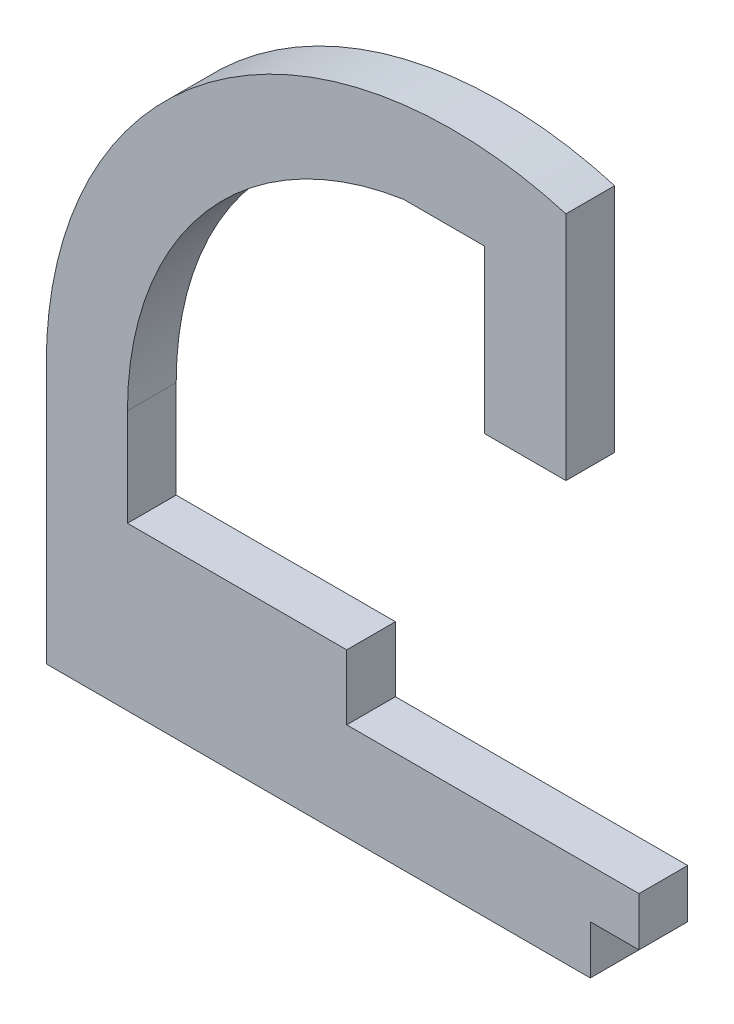
ISO-10303-21;
HEADER;
FILE_DESCRIPTION(('STEP AP214'),'2;1');
FILE_NAME('part.step','',(''),(''),'','','');
FILE_SCHEMA(('AUTOMOTIVE_DESIGN { 1 0 10303 214 1 1 1 1 }'));
ENDSEC;
DATA;
#1=APPLICATION_CONTEXT('core data for automotive mechanical design processes');
#2=APPLICATION_PROTOCOL_DEFINITION('international standard','automotive_design',2000,#1);
#3=PRODUCT_CONTEXT('',#1,'mechanical');
#4=PRODUCT('Part','Part','',(#3));
#5=PRODUCT_RELATED_PRODUCT_CATEGORY('part','',(#4));
#6=PRODUCT_DEFINITION_FORMATION('','',#4);
#7=PRODUCT_DEFINITION_CONTEXT('part definition',#1,'design');
#8=PRODUCT_DEFINITION('design','',#6,#7);
#9=PRODUCT_DEFINITION_SHAPE('','',#8);
#10=(LENGTH_UNIT() NAMED_UNIT(*) SI_UNIT(.MILLI.,.METRE.));
#11=(NAMED_UNIT(*) PLANE_ANGLE_UNIT() SI_UNIT($,.RADIAN.));
#12=(NAMED_UNIT(*) SI_UNIT($,.STERADIAN.) SOLID_ANGLE_UNIT());
#13=UNCERTAINTY_MEASURE_WITH_UNIT(LENGTH_MEASURE(1.E-05),#10,'distance_accuracy_value','');
#14=(GEOMETRIC_REPRESENTATION_CONTEXT(3) GLOBAL_UNCERTAINTY_ASSIGNED_CONTEXT((#13)) GLOBAL_UNIT_ASSIGNED_CONTEXT((#10,
#11,#12)) REPRESENTATION_CONTEXT('',''));
#15=CARTESIAN_POINT('',(0.,0.,0.));
#16=DIRECTION('',(0.,0.,1.));
#17=DIRECTION('',(1.,0.,0.));
#18=AXIS2_PLACEMENT_3D('',#15,#16,#17);
#19=CARTESIAN_POINT('',(0.,0.,6.));
#20=DIRECTION('',(0.,1.,0.));
#21=DIRECTION('',(0.,0.,1.));
#22=AXIS2_PLACEMENT_3D('',#19,#20,#21);
#23=PLANE('',#22);
#24=DIRECTION('',(1.,0.,0.));
#25=VECTOR('',#24,1.);
#26=CARTESIAN_POINT('',(0.,0.,0.));
#27=LINE('',#26,#25);
#28=CARTESIAN_POINT('',(0.,0.,0.));
#29=VERTEX_POINT('',#28);
#30=CARTESIAN_POINT('',(67.,0.,0.));
#31=VERTEX_POINT('',#30);
#32=EDGE_CURVE('E171',#29,#31,#27,.T.);
#33=ORIENTED_EDGE('',*,*,#32,.T.);
#34=DIRECTION('',(0.,0.,-1.));
#35=VECTOR('',#34,1.);
#36=CARTESIAN_POINT('',(67.,0.,6.));
#37=LINE('',#36,#35);
#38=CARTESIAN_POINT('',(67.,0.,6.));
#39=VERTEX_POINT('',#38);
#40=EDGE_CURVE('E11',#39,#31,#37,.T.);
#41=ORIENTED_EDGE('',*,*,#40,.F.);
#42=DIRECTION('',(1.,0.,0.));
#43=VECTOR('',#42,1.);
#44=CARTESIAN_POINT('',(0.,0.,6.));
#45=LINE('',#44,#43);
#46=CARTESIAN_POINT('',(0.,0.,6.));
#47=VERTEX_POINT('',#46);
#48=EDGE_CURVE('E200',#47,#39,#45,.T.);
#49=ORIENTED_EDGE('',*,*,#48,.F.);
#50=DIRECTION('',(0.,0.,-1.));
#51=VECTOR('',#50,1.);
#52=CARTESIAN_POINT('',(0.,0.,6.));
#53=LINE('',#52,#51);
#54=EDGE_CURVE('E167',#47,#29,#53,.T.);
#55=ORIENTED_EDGE('',*,*,#54,.T.);
#56=EDGE_LOOP('',(#33,#41,#49,#55));
#57=FACE_BOUND('',#56,.T.);
#58=ADVANCED_FACE('F33',(#57),#23,.F.);
#59=CARTESIAN_POINT('',(67.,6.,6.));
#60=DIRECTION('',(-1.,0.,0.));
#61=DIRECTION('',(0.,0.,1.));
#62=AXIS2_PLACEMENT_3D('',#59,#60,#61);
#63=PLANE('',#62);
#64=DIRECTION('',(0.,1.,0.));
#65=VECTOR('',#64,1.);
#66=CARTESIAN_POINT('',(67.,6.,0.));
#67=LINE('',#66,#65);
#68=CARTESIAN_POINT('',(67.,6.,0.));
#69=VERTEX_POINT('',#68);
#70=EDGE_CURVE('E174',#31,#69,#67,.T.);
#71=ORIENTED_EDGE('',*,*,#70,.T.);
#72=DIRECTION('',(0.,0.,-1.));
#73=VECTOR('',#72,1.);
#74=CARTESIAN_POINT('',(67.,6.,6.));
#75=LINE('',#74,#73);
#76=CARTESIAN_POINT('',(67.,6.,6.));
#77=VERTEX_POINT('',#76);
#78=EDGE_CURVE('E41',#77,#69,#75,.T.);
#79=ORIENTED_EDGE('',*,*,#78,.F.);
#80=DIRECTION('',(0.,1.,0.));
#81=VECTOR('',#80,1.);
#82=CARTESIAN_POINT('',(67.,6.,6.));
#83=LINE('',#82,#81);
#84=EDGE_CURVE('E113',#39,#77,#83,.T.);
#85=ORIENTED_EDGE('',*,*,#84,.F.);
#86=ORIENTED_EDGE('',*,*,#40,.T.);
#87=EDGE_LOOP('',(#71,#79,#85,#86));
#88=FACE_BOUND('',#87,.T.);
#89=ADVANCED_FACE('F292',(#88),#63,.F.);
#90=CARTESIAN_POINT('',(73.,6.,6.));
#91=DIRECTION('',(0.,1.,0.));
#92=DIRECTION('',(-1.,0.,0.));
#93=AXIS2_PLACEMENT_3D('',#90,#91,#92);
#94=PLANE('',#93);
#95=DIRECTION('',(1.,0.,0.));
#96=VECTOR('',#95,1.);
#97=CARTESIAN_POINT('',(73.,6.,0.));
#98=LINE('',#97,#96);
#99=CARTESIAN_POINT('',(73.,6.,0.));
#100=VERTEX_POINT('',#99);
#101=EDGE_CURVE('E176',#69,#100,#98,.T.);
#102=ORIENTED_EDGE('',*,*,#101,.T.);
#103=DIRECTION('',(0.,0.,-1.));
#104=VECTOR('',#103,1.);
#105=CARTESIAN_POINT('',(73.,6.,6.));
#106=LINE('',#105,#104);
#107=CARTESIAN_POINT('',(73.,6.,6.));
#108=VERTEX_POINT('',#107);
#109=EDGE_CURVE('E228',#108,#100,#106,.T.);
#110=ORIENTED_EDGE('',*,*,#109,.F.);
#111=DIRECTION('',(1.,0.,0.));
#112=VECTOR('',#111,1.);
#113=CARTESIAN_POINT('',(73.,6.,6.));
#114=LINE('',#113,#112);
#115=EDGE_CURVE('E236',#77,#108,#114,.T.);
#116=ORIENTED_EDGE('',*,*,#115,.F.);
#117=ORIENTED_EDGE('',*,*,#78,.T.);
#118=EDGE_LOOP('',(#102,#110,#116,#117));
#119=FACE_BOUND('',#118,.T.);
#120=ADVANCED_FACE('F234',(#119),#94,.F.);
#121=CARTESIAN_POINT('',(73.,12.,6.));
#122=DIRECTION('',(-1.,0.,0.));
#123=DIRECTION('',(0.,0.,1.));
#124=AXIS2_PLACEMENT_3D('',#121,#122,#123);
#125=PLANE('',#124);
#126=DIRECTION('',(0.,1.,0.));
#127=VECTOR('',#126,1.);
#128=CARTESIAN_POINT('',(73.,12.,0.));
#129=LINE('',#128,#127);
#130=CARTESIAN_POINT('',(73.,12.,0.));
#131=VERTEX_POINT('',#130);
#132=EDGE_CURVE('E178',#100,#131,#129,.T.);
#133=ORIENTED_EDGE('',*,*,#132,.T.);
#134=DIRECTION('',(0.,0.,-1.));
#135=VECTOR('',#134,1.);
#136=CARTESIAN_POINT('',(73.,12.,6.));
#137=LINE('',#136,#135);
#138=CARTESIAN_POINT('',(73.,12.,6.));
#139=VERTEX_POINT('',#138);
#140=EDGE_CURVE('E225',#139,#131,#137,.T.);
#141=ORIENTED_EDGE('',*,*,#140,.F.);
#142=DIRECTION('',(0.,1.,0.));
#143=VECTOR('',#142,1.);
#144=CARTESIAN_POINT('',(73.,12.,6.));
#145=LINE('',#144,#143);
#146=EDGE_CURVE('E253',#108,#139,#145,.T.);
#147=ORIENTED_EDGE('',*,*,#146,.F.);
#148=ORIENTED_EDGE('',*,*,#109,.T.);
#149=EDGE_LOOP('',(#133,#141,#147,#148));
#150=FACE_BOUND('',#149,.T.);
#151=ADVANCED_FACE('F244',(#150),#125,.F.);
#152=CARTESIAN_POINT('',(37.,12.,6.));
#153=DIRECTION('',(0.,-1.,0.));
#154=DIRECTION('',(0.,0.,-1.));
#155=AXIS2_PLACEMENT_3D('',#152,#153,#154);
#156=PLANE('',#155);
#157=DIRECTION('',(-1.,0.,0.));
#158=VECTOR('',#157,1.);
#159=CARTESIAN_POINT('',(37.,12.,0.));
#160=LINE('',#159,#158);
#161=CARTESIAN_POINT('',(37.,12.,0.));
#162=VERTEX_POINT('',#161);
#163=EDGE_CURVE('E181',#131,#162,#160,.T.);
#164=ORIENTED_EDGE('',*,*,#163,.T.);
#165=DIRECTION('',(0.,0.,-1.));
#166=VECTOR('',#165,1.);
#167=CARTESIAN_POINT('',(37.,12.,6.));
#168=LINE('',#167,#166);
#169=CARTESIAN_POINT('',(37.,12.,6.));
#170=VERTEX_POINT('',#169);
#171=EDGE_CURVE('E222',#170,#162,#168,.T.);
#172=ORIENTED_EDGE('',*,*,#171,.F.);
#173=DIRECTION('',(-1.,0.,0.));
#174=VECTOR('',#173,1.);
#175=CARTESIAN_POINT('',(67.,12.,6.));
#176=LINE('',#175,#174);
#177=EDGE_CURVE('E250',#139,#170,#176,.T.);
#178=ORIENTED_EDGE('',*,*,#177,.F.);
#179=ORIENTED_EDGE('',*,*,#140,.T.);
#180=EDGE_LOOP('',(#164,#172,#178,#179));
#181=FACE_BOUND('',#180,.T.);
#182=ADVANCED_FACE('F248',(#181),#156,.F.);
#183=CARTESIAN_POINT('',(37.,20.,6.));
#184=DIRECTION('',(-1.,0.,0.));
#185=DIRECTION('',(0.,0.,1.));
#186=AXIS2_PLACEMENT_3D('',#183,#184,#185);
#187=PLANE('',#186);
#188=DIRECTION('',(0.,1.,0.));
#189=VECTOR('',#188,1.);
#190=CARTESIAN_POINT('',(37.,20.,0.));
#191=LINE('',#190,#189);
#192=CARTESIAN_POINT('',(37.,20.,0.));
#193=VERTEX_POINT('',#192);
#194=EDGE_CURVE('E183',#162,#193,#191,.T.);
#195=ORIENTED_EDGE('',*,*,#194,.T.);
#196=DIRECTION('',(0.,0.,-1.));
#197=VECTOR('',#196,1.);
#198=CARTESIAN_POINT('',(37.,20.,6.));
#199=LINE('',#198,#197);
#200=CARTESIAN_POINT('',(37.,20.,6.));
#201=VERTEX_POINT('',#200);
#202=EDGE_CURVE('E219',#201,#193,#199,.T.);
#203=ORIENTED_EDGE('',*,*,#202,.F.);
#204=DIRECTION('',(0.,1.,0.));
#205=VECTOR('',#204,1.);
#206=CARTESIAN_POINT('',(37.,20.,6.));
#207=LINE('',#206,#205);
#208=EDGE_CURVE('E252',#170,#201,#207,.T.);
#209=ORIENTED_EDGE('',*,*,#208,.F.);
#210=ORIENTED_EDGE('',*,*,#171,.T.);
#211=EDGE_LOOP('',(#195,#203,#209,#210));
#212=FACE_BOUND('',#211,.T.);
#213=ADVANCED_FACE('F305',(#212),#187,.F.);
#214=CARTESIAN_POINT('',(10.,20.,6.));
#215=DIRECTION('',(0.,-1.,0.));
#216=DIRECTION('',(1.,0.,0.));
#217=AXIS2_PLACEMENT_3D('',#214,#215,#216);
#218=PLANE('',#217);
#219=DIRECTION('',(-1.,0.,0.));
#220=VECTOR('',#219,1.);
#221=CARTESIAN_POINT('',(10.,20.,0.));
#222=LINE('',#221,#220);
#223=CARTESIAN_POINT('',(10.,20.,0.));
#224=VERTEX_POINT('',#223);
#225=EDGE_CURVE('E185',#193,#224,#222,.T.);
#226=ORIENTED_EDGE('',*,*,#225,.T.);
#227=DIRECTION('',(0.,0.,-1.));
#228=VECTOR('',#227,1.);
#229=CARTESIAN_POINT('',(10.,20.,6.));
#230=LINE('',#229,#228);
#231=CARTESIAN_POINT('',(10.,20.,6.));
#232=VERTEX_POINT('',#231);
#233=EDGE_CURVE('E216',#232,#224,#230,.T.);
#234=ORIENTED_EDGE('',*,*,#233,.F.);
#235=DIRECTION('',(-1.,0.,0.));
#236=VECTOR('',#235,1.);
#237=CARTESIAN_POINT('',(10.,20.,6.));
#238=LINE('',#237,#236);
#239=EDGE_CURVE('E255',#201,#232,#238,.T.);
#240=ORIENTED_EDGE('',*,*,#239,.F.);
#241=ORIENTED_EDGE('',*,*,#202,.T.);
#242=EDGE_LOOP('',(#226,#234,#240,#241));
#243=FACE_BOUND('',#242,.T.);
#244=ADVANCED_FACE('F308',(#243),#218,.F.);
#245=CARTESIAN_POINT('',(10.,20.,6.));
#246=DIRECTION('',(-1.,0.,0.));
#247=DIRECTION('',(0.,0.,1.));
#248=AXIS2_PLACEMENT_3D('',#245,#246,#247);
#249=PLANE('',#248);
#250=DIRECTION('',(0.,1.,0.));
#251=VECTOR('',#250,1.);
#252=CARTESIAN_POINT('',(10.,20.,0.));
#253=LINE('',#252,#251);
#254=CARTESIAN_POINT('',(10.,32.,0.));
#255=VERTEX_POINT('',#254);
#256=EDGE_CURVE('E187',#224,#255,#253,.T.);
#257=ORIENTED_EDGE('',*,*,#256,.T.);
#258=DIRECTION('',(0.,0.,-1.));
#259=VECTOR('',#258,1.);
#260=CARTESIAN_POINT('',(10.,32.,6.));
#261=LINE('',#260,#259);
#262=CARTESIAN_POINT('',(10.,32.,6.));
#263=VERTEX_POINT('',#262);
#264=EDGE_CURVE('E213',#263,#255,#261,.T.);
#265=ORIENTED_EDGE('',*,*,#264,.F.);
#266=DIRECTION('',(0.,1.,0.));
#267=VECTOR('',#266,1.);
#268=CARTESIAN_POINT('',(10.,20.,6.));
#269=LINE('',#268,#267);
#270=EDGE_CURVE('E261',#232,#263,#269,.T.);
#271=ORIENTED_EDGE('',*,*,#270,.F.);
#272=ORIENTED_EDGE('',*,*,#233,.T.);
#273=EDGE_LOOP('',(#257,#265,#271,#272));
#274=FACE_BOUND('',#273,.T.);
#275=ADVANCED_FACE('F312',(#274),#249,.F.);
#276=CARTESIAN_POINT('',(50.,32.,6.));
#277=DIRECTION('',(0.,0.,-1.));
#278=DIRECTION('',(-1.,0.,0.));
#279=AXIS2_PLACEMENT_3D('',#276,#277,#278);
#280=CYLINDRICAL_SURFACE('',#279,40.);
#281=CARTESIAN_POINT('',(50.,32.,0.));
#282=DIRECTION('',(0.,0.,-1.));
#283=DIRECTION('',(1.,0.,0.));
#284=AXIS2_PLACEMENT_3D('',#281,#282,#283);
#285=CIRCLE('',#284,40.);
#286=CARTESIAN_POINT('',(44.,71.5474398665704,0.));
#287=VERTEX_POINT('',#286);
#288=EDGE_CURVE('E189',#255,#287,#285,.T.);
#289=ORIENTED_EDGE('',*,*,#288,.T.);
#290=DIRECTION('',(0.,0.,-1.));
#291=VECTOR('',#290,1.);
#292=CARTESIAN_POINT('',(44.,71.5474398665704,6.));
#293=LINE('',#292,#291);
#294=CARTESIAN_POINT('',(44.,71.5474398665704,6.));
#295=VERTEX_POINT('',#294);
#296=EDGE_CURVE('E210',#295,#287,#293,.T.);
#297=ORIENTED_EDGE('',*,*,#296,.F.);
#298=CARTESIAN_POINT('',(50.,32.,6.));
#299=DIRECTION('',(0.,0.,-1.));
#300=DIRECTION('',(1.,0.,0.));
#301=AXIS2_PLACEMENT_3D('',#298,#299,#300);
#302=CIRCLE('',#301,40.);
#303=EDGE_CURVE('E263',#263,#295,#302,.T.);
#304=ORIENTED_EDGE('',*,*,#303,.F.);
#305=ORIENTED_EDGE('',*,*,#264,.T.);
#306=EDGE_LOOP('',(#289,#297,#304,#305));
#307=FACE_BOUND('',#306,.T.);
#308=ADVANCED_FACE('F316',(#307),#280,.F.);
#309=CARTESIAN_POINT('',(54.,71.5474398665704,6.));
#310=DIRECTION('',(0.,1.,0.));
#311=DIRECTION('',(0.,0.,1.));
#312=AXIS2_PLACEMENT_3D('',#309,#310,#311);
#313=PLANE('',#312);
#314=DIRECTION('',(1.,0.,0.));
#315=VECTOR('',#314,1.);
#316=CARTESIAN_POINT('',(54.,71.5474398665704,0.));
#317=LINE('',#316,#315);
#318=CARTESIAN_POINT('',(54.,71.5474398665704,0.));
#319=VERTEX_POINT('',#318);
#320=EDGE_CURVE('E191',#287,#319,#317,.T.);
#321=ORIENTED_EDGE('',*,*,#320,.T.);
#322=DIRECTION('',(0.,0.,-1.));
#323=VECTOR('',#322,1.);
#324=CARTESIAN_POINT('',(54.,71.5474398665704,6.));
#325=LINE('',#324,#323);
#326=CARTESIAN_POINT('',(54.,71.5474398665704,6.));
#327=VERTEX_POINT('',#326);
#328=EDGE_CURVE('E207',#327,#319,#325,.T.);
#329=ORIENTED_EDGE('',*,*,#328,.F.);
#330=DIRECTION('',(1.,0.,0.));
#331=VECTOR('',#330,1.);
#332=CARTESIAN_POINT('',(54.,71.5474398665704,6.));
#333=LINE('',#332,#331);
#334=EDGE_CURVE('E265',#295,#327,#333,.T.);
#335=ORIENTED_EDGE('',*,*,#334,.F.);
#336=ORIENTED_EDGE('',*,*,#296,.T.);
#337=EDGE_LOOP('',(#321,#329,#335,#336));
#338=FACE_BOUND('',#337,.T.);
#339=ADVANCED_FACE('F320',(#338),#313,.F.);
#340=CARTESIAN_POINT('',(54.,71.5474398665704,6.));
#341=DIRECTION('',(1.,0.,0.));
#342=DIRECTION('',(0.,0.,-1.));
#343=AXIS2_PLACEMENT_3D('',#340,#341,#342);
#344=PLANE('',#343);
#345=DIRECTION('',(0.,-1.,0.));
#346=VECTOR('',#345,1.);
#347=CARTESIAN_POINT('',(54.,71.5474398665704,0.));
#348=LINE('',#347,#346);
#349=CARTESIAN_POINT('',(54.,51.5474398665704,0.));
#350=VERTEX_POINT('',#349);
#351=EDGE_CURVE('E193',#319,#350,#348,.T.);
#352=ORIENTED_EDGE('',*,*,#351,.T.);
#353=DIRECTION('',(0.,0.,-1.));
#354=VECTOR('',#353,1.);
#355=CARTESIAN_POINT('',(54.,51.5474398665704,6.));
#356=LINE('',#355,#354);
#357=CARTESIAN_POINT('',(54.,51.5474398665704,6.));
#358=VERTEX_POINT('',#357);
#359=EDGE_CURVE('E204',#358,#350,#356,.T.);
#360=ORIENTED_EDGE('',*,*,#359,.F.);
#361=DIRECTION('',(0.,-1.,0.));
#362=VECTOR('',#361,1.);
#363=CARTESIAN_POINT('',(54.,71.5474398665704,6.));
#364=LINE('',#363,#362);
#365=EDGE_CURVE('E267',#327,#358,#364,.T.);
#366=ORIENTED_EDGE('',*,*,#365,.F.);
#367=ORIENTED_EDGE('',*,*,#328,.T.);
#368=EDGE_LOOP('',(#352,#360,#366,#367));
#369=FACE_BOUND('',#368,.T.);
#370=ADVANCED_FACE('F273',(#369),#344,.F.);
#371=CARTESIAN_POINT('',(54.,51.5474398665704,6.));
#372=DIRECTION('',(0.,1.,0.));
#373=DIRECTION('',(0.,0.,1.));
#374=AXIS2_PLACEMENT_3D('',#371,#372,#373);
#375=PLANE('',#374);
#376=DIRECTION('',(1.,0.,0.));
#377=VECTOR('',#376,1.);
#378=CARTESIAN_POINT('',(54.,51.5474398665704,0.));
#379=LINE('',#378,#377);
#380=CARTESIAN_POINT('',(64.,51.5474398665704,0.));
#381=VERTEX_POINT('',#380);
#382=EDGE_CURVE('E195',#350,#381,#379,.T.);
#383=ORIENTED_EDGE('',*,*,#382,.T.);
#384=DIRECTION('',(0.,0.,-1.));
#385=VECTOR('',#384,1.);
#386=CARTESIAN_POINT('',(64.,51.5474398665704,6.));
#387=LINE('',#386,#385);
#388=CARTESIAN_POINT('',(64.,51.5474398665704,6.));
#389=VERTEX_POINT('',#388);
#390=EDGE_CURVE('E162',#389,#381,#387,.T.);
#391=ORIENTED_EDGE('',*,*,#390,.F.);
#392=DIRECTION('',(1.,0.,0.));
#393=VECTOR('',#392,1.);
#394=CARTESIAN_POINT('',(54.,51.5474398665704,6.));
#395=LINE('',#394,#393);
#396=EDGE_CURVE('E153',#358,#389,#395,.T.);
#397=ORIENTED_EDGE('',*,*,#396,.F.);
#398=ORIENTED_EDGE('',*,*,#359,.T.);
#399=EDGE_LOOP('',(#383,#391,#397,#398));
#400=FACE_BOUND('',#399,.T.);
#401=ADVANCED_FACE('F277',(#400),#375,.F.);
#402=CARTESIAN_POINT('',(64.,80.,6.));
#403=DIRECTION('',(-1.,0.,0.));
#404=DIRECTION('',(0.,0.,1.));
#405=AXIS2_PLACEMENT_3D('',#402,#403,#404);
#406=PLANE('',#405);
#407=DIRECTION('',(0.,1.,0.));
#408=VECTOR('',#407,1.);
#409=CARTESIAN_POINT('',(64.,80.,0.));
#410=LINE('',#409,#408);
#411=CARTESIAN_POINT('',(64.,80.,0.));
#412=VERTEX_POINT('',#411);
#413=EDGE_CURVE('E161',#381,#412,#410,.T.);
#414=ORIENTED_EDGE('',*,*,#413,.T.);
#415=DIRECTION('',(0.,0.,-1.));
#416=VECTOR('',#415,1.);
#417=CARTESIAN_POINT('',(64.,80.,6.));
#418=LINE('',#417,#416);
#419=CARTESIAN_POINT('',(64.,80.,6.));
#420=VERTEX_POINT('',#419);
#421=EDGE_CURVE('E158',#420,#412,#418,.T.);
#422=ORIENTED_EDGE('',*,*,#421,.F.);
#423=DIRECTION('',(0.,1.,0.));
#424=VECTOR('',#423,1.);
#425=CARTESIAN_POINT('',(64.,80.,6.));
#426=LINE('',#425,#424);
#427=EDGE_CURVE('E147',#389,#420,#426,.T.);
#428=ORIENTED_EDGE('',*,*,#427,.F.);
#429=ORIENTED_EDGE('',*,*,#390,.T.);
#430=EDGE_LOOP('',(#414,#422,#428,#429));
#431=FACE_BOUND('',#430,.T.);
#432=ADVANCED_FACE('F159',(#431),#406,.F.);
#433=CARTESIAN_POINT('',(50.,32.,6.));
#434=DIRECTION('',(0.,0.,-1.));
#435=DIRECTION('',(-1.,0.,0.));
#436=AXIS2_PLACEMENT_3D('',#433,#434,#435);
#437=CYLINDRICAL_SURFACE('',#436,50.);
#438=CARTESIAN_POINT('',(50.,32.,0.));
#439=DIRECTION('',(0.,0.,1.));
#440=DIRECTION('',(1.,0.,0.));
#441=AXIS2_PLACEMENT_3D('',#438,#439,#440);
#442=CIRCLE('',#441,50.);
#443=CARTESIAN_POINT('',(0.,32.,0.));
#444=VERTEX_POINT('',#443);
#445=EDGE_CURVE('E99',#412,#444,#442,.T.);
#446=ORIENTED_EDGE('',*,*,#445,.T.);
#447=DIRECTION('',(0.,0.,-1.));
#448=VECTOR('',#447,1.);
#449=CARTESIAN_POINT('',(0.,32.,6.));
#450=LINE('',#449,#448);
#451=CARTESIAN_POINT('',(0.,32.,6.));
#452=VERTEX_POINT('',#451);
#453=EDGE_CURVE('E163',#452,#444,#450,.T.);
#454=ORIENTED_EDGE('',*,*,#453,.F.);
#455=CARTESIAN_POINT('',(50.,32.,6.));
#456=DIRECTION('',(0.,0.,1.));
#457=DIRECTION('',(1.,0.,0.));
#458=AXIS2_PLACEMENT_3D('',#455,#456,#457);
#459=CIRCLE('',#458,50.);
#460=EDGE_CURVE('E151',#420,#452,#459,.T.);
#461=ORIENTED_EDGE('',*,*,#460,.F.);
#462=ORIENTED_EDGE('',*,*,#421,.T.);
#463=EDGE_LOOP('',(#446,#454,#461,#462));
#464=FACE_BOUND('',#463,.T.);
#465=ADVANCED_FACE('F165',(#464),#437,.T.);
#466=CARTESIAN_POINT('',(0.,32.,6.));
#467=DIRECTION('',(1.,0.,0.));
#468=DIRECTION('',(0.,0.,-1.));
#469=AXIS2_PLACEMENT_3D('',#466,#467,#468);
#470=PLANE('',#469);
#471=DIRECTION('',(0.,-1.,0.));
#472=VECTOR('',#471,1.);
#473=CARTESIAN_POINT('',(0.,32.,0.));
#474=LINE('',#473,#472);
#475=EDGE_CURVE('E105',#444,#29,#474,.T.);
#476=ORIENTED_EDGE('',*,*,#475,.T.);
#477=ORIENTED_EDGE('',*,*,#54,.F.);
#478=DIRECTION('',(0.,-1.,0.));
#479=VECTOR('',#478,1.);
#480=CARTESIAN_POINT('',(0.,32.,6.));
#481=LINE('',#480,#479);
#482=EDGE_CURVE('E49',#452,#47,#481,.T.);
#483=ORIENTED_EDGE('',*,*,#482,.F.);
#484=ORIENTED_EDGE('',*,*,#453,.T.);
#485=EDGE_LOOP('',(#476,#477,#483,#484));
#486=FACE_BOUND('',#485,.T.);
#487=ADVANCED_FACE('F281',(#486),#470,.F.);
#488=CARTESIAN_POINT('',(50.,32.,6.));
#489=DIRECTION('',(0.,0.,1.));
#490=DIRECTION('',(1.,0.,0.));
#491=AXIS2_PLACEMENT_3D('',#488,#489,#490);
#492=PLANE('',#491);
#493=ORIENTED_EDGE('',*,*,#48,.T.);
#494=ORIENTED_EDGE('',*,*,#84,.T.);
#495=ORIENTED_EDGE('',*,*,#115,.T.);
#496=ORIENTED_EDGE('',*,*,#146,.T.);
#497=ORIENTED_EDGE('',*,*,#177,.T.);
#498=ORIENTED_EDGE('',*,*,#208,.T.);
#499=ORIENTED_EDGE('',*,*,#239,.T.);
#500=ORIENTED_EDGE('',*,*,#270,.T.);
#501=ORIENTED_EDGE('',*,*,#303,.T.);
#502=ORIENTED_EDGE('',*,*,#334,.T.);
#503=ORIENTED_EDGE('',*,*,#365,.T.);
#504=ORIENTED_EDGE('',*,*,#396,.T.);
#505=ORIENTED_EDGE('',*,*,#427,.T.);
#506=ORIENTED_EDGE('',*,*,#460,.T.);
#507=ORIENTED_EDGE('',*,*,#482,.T.);
#508=EDGE_LOOP('',(#493,#494,#495,#496,#497,#498,#499,#500,#501,#502,#503,#504,#505,#506,#507));
#509=FACE_BOUND('',#508,.T.);
#510=ADVANCED_FACE('F149',(#509),#492,.T.);
#511=CARTESIAN_POINT('',(50.,32.,0.));
#512=DIRECTION('',(0.,0.,1.));
#513=DIRECTION('',(1.,0.,0.));
#514=AXIS2_PLACEMENT_3D('',#511,#512,#513);
#515=PLANE('',#514);
#516=ORIENTED_EDGE('',*,*,#32,.F.);
#517=ORIENTED_EDGE('',*,*,#475,.F.);
#518=ORIENTED_EDGE('',*,*,#445,.F.);
#519=ORIENTED_EDGE('',*,*,#413,.F.);
#520=ORIENTED_EDGE('',*,*,#382,.F.);
#521=ORIENTED_EDGE('',*,*,#351,.F.);
#522=ORIENTED_EDGE('',*,*,#320,.F.);
#523=ORIENTED_EDGE('',*,*,#288,.F.);
#524=ORIENTED_EDGE('',*,*,#256,.F.);
#525=ORIENTED_EDGE('',*,*,#225,.F.);
#526=ORIENTED_EDGE('',*,*,#194,.F.);
#527=ORIENTED_EDGE('',*,*,#163,.F.);
#528=ORIENTED_EDGE('',*,*,#132,.F.);
#529=ORIENTED_EDGE('',*,*,#101,.F.);
#530=ORIENTED_EDGE('',*,*,#70,.F.);
#531=EDGE_LOOP('',(#516,#517,#518,#519,#520,#521,#522,#523,#524,#525,#526,#527,#528,#529,#530));
#532=FACE_BOUND('',#531,.T.);
#533=ADVANCED_FACE('F240',(#532),#515,.F.);
#534=CLOSED_SHELL('',(#58,#89,#120,#151,#182,#213,#244,#275,#308,#339,#370,#401,#432,#465,#487,
#510,#533));
#535=MANIFOLD_SOLID_BREP('B2',#534);
#536=ADVANCED_BREP_SHAPE_REPRESENTATION('',(#18,#535),#14);
#537=SHAPE_DEFINITION_REPRESENTATION(#9,#536);
ENDSEC;
END-ISO-10303-21;
